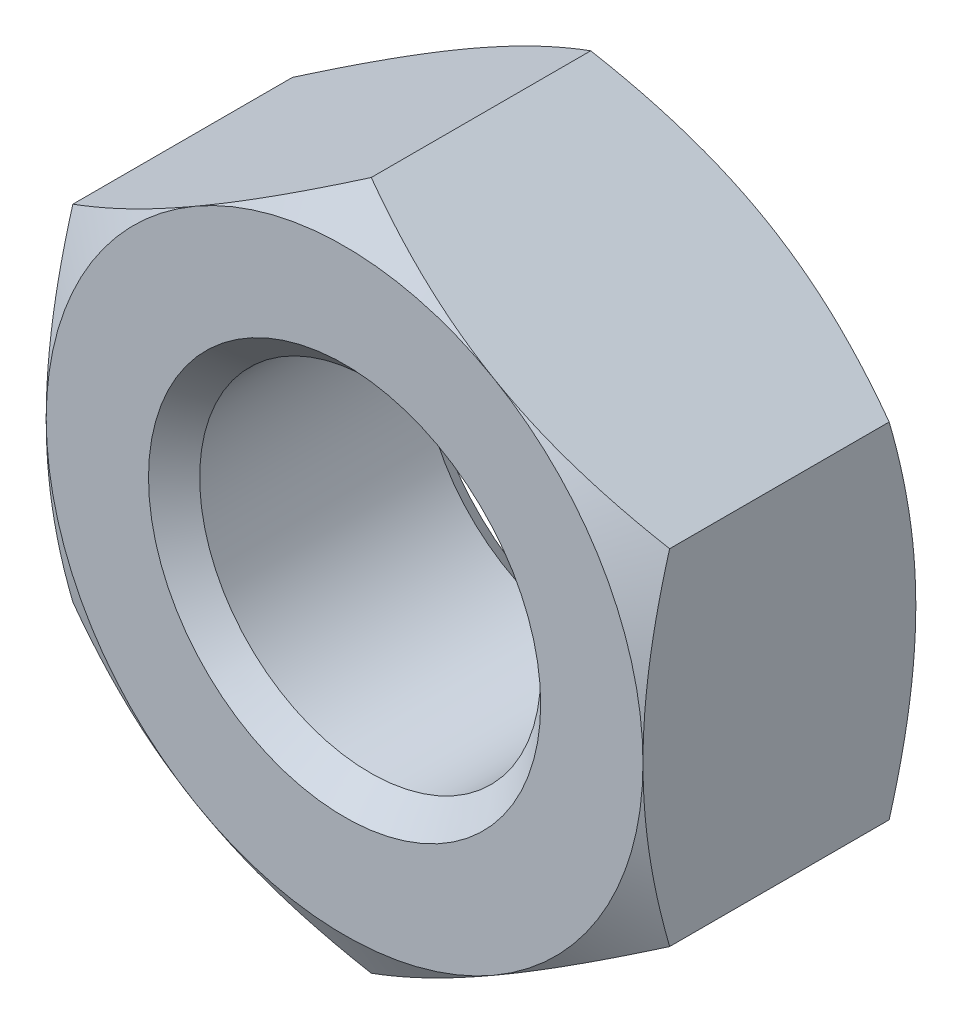
ISO-10303-21;
HEADER;
FILE_DESCRIPTION(('STEP AP214'),'2;1');
FILE_NAME('part.step','',(''),(''),'','','');
FILE_SCHEMA(('AUTOMOTIVE_DESIGN { 1 0 10303 214 1 1 1 1 }'));
ENDSEC;
DATA;
#1=APPLICATION_CONTEXT('core data for automotive mechanical design processes');
#2=APPLICATION_PROTOCOL_DEFINITION('international standard','automotive_design',2000,#1);
#3=PRODUCT_CONTEXT('',#1,'mechanical');
#4=PRODUCT('Part','Part','',(#3));
#5=PRODUCT_RELATED_PRODUCT_CATEGORY('part','',(#4));
#6=PRODUCT_DEFINITION_FORMATION('','',#4);
#7=PRODUCT_DEFINITION_CONTEXT('part definition',#1,'design');
#8=PRODUCT_DEFINITION('design','',#6,#7);
#9=PRODUCT_DEFINITION_SHAPE('','',#8);
#10=(LENGTH_UNIT() NAMED_UNIT(*) SI_UNIT(.MILLI.,.METRE.));
#11=(NAMED_UNIT(*) PLANE_ANGLE_UNIT() SI_UNIT($,.RADIAN.));
#12=(NAMED_UNIT(*) SI_UNIT($,.STERADIAN.) SOLID_ANGLE_UNIT());
#13=UNCERTAINTY_MEASURE_WITH_UNIT(LENGTH_MEASURE(1.E-05),#10,'distance_accuracy_value','');
#14=(GEOMETRIC_REPRESENTATION_CONTEXT(3) GLOBAL_UNCERTAINTY_ASSIGNED_CONTEXT((#13)) GLOBAL_UNIT_ASSIGNED_CONTEXT((#10,
#11,#12)) REPRESENTATION_CONTEXT('',''));
#15=CARTESIAN_POINT('',(0.,0.,0.));
#16=DIRECTION('',(0.,0.,1.));
#17=DIRECTION('',(1.,0.,0.));
#18=AXIS2_PLACEMENT_3D('',#15,#16,#17);
#19=CARTESIAN_POINT('',(0.,0.,3.2));
#20=DIRECTION('',(0.,0.,-1.));
#21=DIRECTION('',(-1.,0.,0.));
#22=AXIS2_PLACEMENT_3D('',#19,#20,#21);
#23=CONICAL_SURFACE('',#22,3.5,1.0471975511966);
#24=CARTESIAN_POINT('',(-0.000200000000001518,4.04156735438122,2.88732593930663));
#25=CARTESIAN_POINT('',(0.153607178452448,3.9527667384984,2.93861421101002));
#26=CARTESIAN_POINT('',(0.308742010834422,3.86319960126198,2.9852590461838));
#27=CARTESIAN_POINT('',(0.62169800657678,3.68251437287562,3.06667812446665));
#28=CARTESIAN_POINT('',(0.779524730787494,3.59139307116725,3.10142356441544));
#29=CARTESIAN_POINT('',(1.09322221038013,3.41027974688034,3.15550997281716));
#30=CARTESIAN_POINT('',(1.24904469916069,3.32031559103708,3.17521091373962));
#31=CARTESIAN_POINT('',(1.56142288720537,3.13996396008051,3.19872986726275));
#32=CARTESIAN_POINT('',(1.71797745103423,3.04957714051106,3.20256735545443));
#33=CARTESIAN_POINT('',(2.01050921992099,2.88068384499777,3.19458469812302));
#34=CARTESIAN_POINT('',(2.1465302124579,2.80215208834114,3.18472456593039));
#35=CARTESIAN_POINT('',(2.41768602028899,2.64560020969753,3.1534735331006));
#36=CARTESIAN_POINT('',(2.55281989768468,2.5675806292065,3.1320719567142));
#37=CARTESIAN_POINT('',(2.82453479240518,2.41070596159678,3.07856959211942));
#38=CARTESIAN_POINT('',(2.96108141927834,2.33187072981463,3.04624200555491));
#39=CARTESIAN_POINT('',(3.2321380929445,2.17537608630783,2.97287106619201));
#40=CARTESIAN_POINT('',(3.36665161246854,2.09771466960098,2.93184495343013));
#41=CARTESIAN_POINT('',(3.5002,2.02061047210985,2.88732593930663));
#42=B_SPLINE_CURVE_WITH_KNOTS('',3,(#24,#25,#26,#27,#28,#29,#30,#31,#32,#33,#34,#35,#36,#37,#38,
#39,#40,#41),.UNSPECIFIED.,.F.,.F.,(4,2,2,2,2,2,2,2,4),(0.,0.554793832886253,1.11092123814984,
1.65328467083219,2.19498204478403,2.6666513085086,3.13875761298267,3.6213361260051,
4.10296698719187),.UNSPECIFIED.);
#43=CARTESIAN_POINT('',(0.,4.04145188432738,2.88739260883036));
#44=VERTEX_POINT('',#43);
#45=CARTESIAN_POINT('',(1.75,3.03108891324554,3.2));
#46=VERTEX_POINT('',#45);
#47=EDGE_CURVE('E291',#44,#46,#42,.T.);
#48=ORIENTED_EDGE('',*,*,#47,.F.);
#49=CARTESIAN_POINT('',(-3.5002,2.02061047210985,2.88732593930663));
#50=CARTESIAN_POINT('',(-3.34639282154755,2.10941108799267,2.93861421101002));
#51=CARTESIAN_POINT('',(-3.19125798916558,2.19897822522909,2.9852590461838));
#52=CARTESIAN_POINT('',(-2.87830199342322,2.37966345361545,3.06667812446665));
#53=CARTESIAN_POINT('',(-2.72047526921251,2.47078475532382,3.10142356441544));
#54=CARTESIAN_POINT('',(-2.40677778961987,2.65189807961073,3.15550997281716));
#55=CARTESIAN_POINT('',(-2.25095530083931,2.74186223545399,3.17521091373962));
#56=CARTESIAN_POINT('',(-1.93857711279463,2.92221386641055,3.19872986726275));
#57=CARTESIAN_POINT('',(-1.78202254896577,3.01260068598001,3.20256735545443));
#58=CARTESIAN_POINT('',(-1.48949078007901,3.1814939814933,3.19458469812302));
#59=CARTESIAN_POINT('',(-1.3534697875421,3.26002573814993,3.18472456593039));
#60=CARTESIAN_POINT('',(-1.08231397971101,3.41657761679353,3.1534735331006));
#61=CARTESIAN_POINT('',(-0.947180102315319,3.49459719728457,3.1320719567142));
#62=CARTESIAN_POINT('',(-0.675465207594818,3.65147186489429,3.07856959211942));
#63=CARTESIAN_POINT('',(-0.538918580721666,3.73030709667644,3.04624200555491));
#64=CARTESIAN_POINT('',(-0.2678619070555,3.88680174018324,2.97287106619201));
#65=CARTESIAN_POINT('',(-0.133348387531465,3.96446315689009,2.93184495343013));
#66=CARTESIAN_POINT('',(0.000199999999998202,4.04156735438122,2.88732593930663));
#67=B_SPLINE_CURVE_WITH_KNOTS('',3,(#49,#50,#51,#52,#53,#54,#55,#56,#57,#58,#59,#60,#61,#62,#63,
#64,#65,#66),.UNSPECIFIED.,.F.,.F.,(4,2,2,2,2,2,2,2,4),(0.,0.554793832886254,1.11092123814984,
1.65328467083219,2.19498204478403,2.6666513085086,3.13875761298267,3.6213361260051,
4.10296698719187),.UNSPECIFIED.);
#68=CARTESIAN_POINT('',(-1.75,3.03108891324553,3.2));
#69=VERTEX_POINT('',#68);
#70=EDGE_CURVE('E186',#69,#44,#67,.T.);
#71=ORIENTED_EDGE('',*,*,#70,.F.);
#72=CARTESIAN_POINT('',(0.,0.,3.2));
#73=DIRECTION('',(0.,0.,1.));
#74=DIRECTION('',(1.,0.,0.));
#75=AXIS2_PLACEMENT_3D('',#72,#73,#74);
#76=CIRCLE('',#75,3.5);
#77=EDGE_CURVE('E294',#46,#69,#76,.T.);
#78=ORIENTED_EDGE('',*,*,#77,.F.);
#79=EDGE_LOOP('',(#48,#71,#78));
#80=FACE_BOUND('',#79,.T.);
#81=ADVANCED_FACE('F35',(#80),#23,.T.);
#82=CARTESIAN_POINT('',(3.5,2.02072594216369,2.88739260883036));
#83=VERTEX_POINT('',#82);
#84=EDGE_CURVE('E229',#46,#83,#42,.T.);
#85=ORIENTED_EDGE('',*,*,#84,.F.);
#86=CARTESIAN_POINT('',(3.5,0.,3.2));
#87=VERTEX_POINT('',#86);
#88=EDGE_CURVE('E151',#87,#46,#76,.T.);
#89=ORIENTED_EDGE('',*,*,#88,.F.);
#90=CARTESIAN_POINT('',(3.5,-5.39607057630177,1.50734573609674));
#91=CARTESIAN_POINT('',(3.5,-5.24346862247673,1.58124273616101));
#92=CARTESIAN_POINT('',(3.5,-5.09051292002839,1.65442190909415));
#93=CARTESIAN_POINT('',(3.5,-4.78370577730185,1.7989402305959));
#94=CARTESIAN_POINT('',(3.5,-4.62985419754606,1.87027908272174));
#95=CARTESIAN_POINT('',(3.5,-4.32025895347236,2.01107815289536));
#96=CARTESIAN_POINT('',(3.5,-4.16450952696473,2.08052574517121));
#97=CARTESIAN_POINT('',(3.5,-3.85176070717065,2.21653605641942));
#98=CARTESIAN_POINT('',(3.5,-3.69476137432274,2.28309891389066));
#99=CARTESIAN_POINT('',(3.5,-3.37431592405336,2.41460734938575));
#100=CARTESIAN_POINT('',(3.5,-3.2108219343119,2.47943692239225));
#101=CARTESIAN_POINT('',(3.5,-2.88190940227227,2.60411191634016));
#102=CARTESIAN_POINT('',(3.5,-2.71649064466644,2.66395677345412));
#103=CARTESIAN_POINT('',(3.5,-2.38378554444925,2.77706789162325));
#104=CARTESIAN_POINT('',(3.5,-2.21650387253554,2.8303477513776));
#105=CARTESIAN_POINT('',(3.5,-1.8795413289971,2.92859816989445));
#106=CARTESIAN_POINT('',(3.5,-1.70986124157588,2.97357137996499));
#107=CARTESIAN_POINT('',(3.5,-1.3689434124043,3.05279133870168));
#108=CARTESIAN_POINT('',(3.5,-1.19771918613086,3.08709516971169));
#109=CARTESIAN_POINT('',(3.5,-0.853175175643459,3.14301616552178));
#110=CARTESIAN_POINT('',(3.5,-0.679855580730875,3.16463446775436));
#111=CARTESIAN_POINT('',(3.5,-0.334236615485038,3.19317618303771));
#112=CARTESIAN_POINT('',(3.5,-0.161953022960658,3.20028595773065));
#113=CARTESIAN_POINT('',(3.5,0.182601685688735,3.19969645918549));
#114=CARTESIAN_POINT('',(3.5,0.354872801428766,3.19199684035087));
#115=CARTESIAN_POINT('',(3.5,0.648296301018979,3.16680984690181));
#116=CARTESIAN_POINT('',(3.5,0.769765843254159,3.1528140822278));
#117=CARTESIAN_POINT('',(3.5,1.01178934087345,3.11834848853307));
#118=CARTESIAN_POINT('',(3.5,1.13234316544353,3.09787775170697));
#119=CARTESIAN_POINT('',(3.5,1.49248573241487,3.02783185035844));
#120=CARTESIAN_POINT('',(3.5,1.73041517752013,2.96963661982691));
#121=CARTESIAN_POINT('',(3.5,2.08613420074905,2.86906323758495));
#122=CARTESIAN_POINT('',(3.5,2.20577628701295,2.83286695169684));
#123=CARTESIAN_POINT('',(3.5,2.44389767487858,2.75679942102856));
#124=CARTESIAN_POINT('',(3.5,2.56237696900387,2.71692815263634));
#125=CARTESIAN_POINT('',(3.5,2.79821193267016,2.63414347854069));
#126=CARTESIAN_POINT('',(3.5,2.91556797780058,2.59123113313497));
#127=CARTESIAN_POINT('',(3.5,3.14931345871437,2.50286044169987));
#128=CARTESIAN_POINT('',(3.5,3.26570290403954,2.45740212083747));
#129=CARTESIAN_POINT('',(3.5,3.53278888396184,2.35025761465171));
#130=CARTESIAN_POINT('',(3.5,3.68318747831663,2.2878301789543));
#131=CARTESIAN_POINT('',(3.5,3.98276288579305,2.16010312309237));
#132=CARTESIAN_POINT('',(3.5,4.13193963530471,2.09480335450574));
#133=CARTESIAN_POINT('',(3.5,4.57798586154448,1.89545429582979));
#134=CARTESIAN_POINT('',(3.5,4.873321089347,1.75797587256347));
#135=CARTESIAN_POINT('',(3.5,5.46135586713875,1.476869132841));
#136=CARTESIAN_POINT('',(3.5,5.75405271996685,1.33323523339219));
#137=CARTESIAN_POINT('',(3.5,6.33736064871425,1.04177841899646));
#138=CARTESIAN_POINT('',(3.5,6.62797165253629,0.893955360117037));
#139=CARTESIAN_POINT('',(3.5,7.18456120860241,0.607214161865801));
#140=CARTESIAN_POINT('',(3.5,7.45065793633446,0.468524639417716));
#141=CARTESIAN_POINT('',(3.5,7.98185207728762,0.189227104360424));
#142=CARTESIAN_POINT('',(3.5,8.24694945925495,0.0486190323749724));
#143=CARTESIAN_POINT('',(3.5,8.77575145405166,-0.233743054144649));
#144=CARTESIAN_POINT('',(3.5,9.03945786649943,-0.375493703344978));
#145=CARTESIAN_POINT('',(3.5,9.56622686486212,-0.660154863528819));
#146=CARTESIAN_POINT('',(3.5,9.82928948287438,-0.803065315089473));
#147=CARTESIAN_POINT('',(3.5,10.0921129259192,-0.9464112464489));
#148=B_SPLINE_CURVE_WITH_KNOTS('',3,(#90,#91,#92,#93,#94,#95,#96,#97,#98,#99,#100,#101,#102,
#103,#104,#105,#106,#107,#108,#109,#110,#111,#112,#113,#114,#115,#116,#117,#118,#119,#120,#121,
#122,#123,#124,#125,#126,#127,#128,#129,#130,#131,#132,#133,#134,#135,#136,#137,#138,#139,#140,
#141,#142,#143,#144,#145,#146,#147),.UNSPECIFIED.,.F.,.F.,(4,2,2,2,2,2,2,2,2,2,2,2,2,2,2,2,2,2,
2,2,2,2,2,2,2,2,2,2,4),(0.,0.508664516050691,1.01741046359623,1.52898032030911,2.04052558879345,
2.56809753708544,3.09572907889285,3.62224862786082,4.14859983134042,4.67208453173465,
5.19552228733582,5.71219306738588,6.22887590476894,6.59551693856609,6.96220939904642,
7.69601555923292,8.07097772947722,8.44594230905185,8.8207767911628,9.19560756868767,
9.68408848540199,10.1725946731184,11.1497698508896,12.1278509000315,13.1059655952369,
14.0061676995822,14.9063977273167,15.8045643362225,16.7026852141871),.UNSPECIFIED.);
#149=EDGE_CURVE('E227',#83,#87,#148,.F.);
#150=ORIENTED_EDGE('',*,*,#149,.F.);
#151=EDGE_LOOP('',(#85,#89,#150));
#152=FACE_BOUND('',#151,.T.);
#153=ADVANCED_FACE('F282',(#152),#23,.T.);
#154=CARTESIAN_POINT('',(3.5,-2.02072594216369,2.88739260883036));
#155=VERTEX_POINT('',#154);
#156=EDGE_CURVE('E222',#87,#155,#148,.F.);
#157=ORIENTED_EDGE('',*,*,#156,.F.);
#158=CARTESIAN_POINT('',(1.75,-3.03108891324554,3.2));
#159=VERTEX_POINT('',#158);
#160=EDGE_CURVE('E297',#159,#87,#76,.T.);
#161=ORIENTED_EDGE('',*,*,#160,.F.);
#162=CARTESIAN_POINT('',(3.5002,-2.02061047210985,2.88732593930663));
#163=CARTESIAN_POINT('',(3.34639282154755,-2.10941108799267,2.93861421101002));
#164=CARTESIAN_POINT('',(3.19125798916558,-2.19897822522909,2.9852590461838));
#165=CARTESIAN_POINT('',(2.87830199342322,-2.37966345361545,3.06667812446665));
#166=CARTESIAN_POINT('',(2.72047526921251,-2.47078475532382,3.10142356441544));
#167=CARTESIAN_POINT('',(2.40677778961987,-2.65189807961073,3.15550997281716));
#168=CARTESIAN_POINT('',(2.25095530083931,-2.74186223545399,3.17521091373962));
#169=CARTESIAN_POINT('',(1.93857711279463,-2.92221386641056,3.19872986726274));
#170=CARTESIAN_POINT('',(1.78202254896577,-3.01260068598001,3.20256735545443));
#171=CARTESIAN_POINT('',(1.48949078007901,-3.1814939814933,3.19458469812302));
#172=CARTESIAN_POINT('',(1.35346978754209,-3.26002573814993,3.18472456593039));
#173=CARTESIAN_POINT('',(1.08231397971101,-3.41657761679354,3.1534735331006));
#174=CARTESIAN_POINT('',(0.947180102315318,-3.49459719728458,3.1320719567142));
#175=CARTESIAN_POINT('',(0.675465207594817,-3.65147186489429,3.07856959211942));
#176=CARTESIAN_POINT('',(0.538918580721666,-3.73030709667644,3.04624200555491));
#177=CARTESIAN_POINT('',(0.2678619070555,-3.88680174018324,2.97287106619201));
#178=CARTESIAN_POINT('',(0.133348387531465,-3.96446315689009,2.93184495343013));
#179=CARTESIAN_POINT('',(-0.000199999999998495,-4.04156735438122,2.88732593930663));
#180=B_SPLINE_CURVE_WITH_KNOTS('',3,(#162,#163,#164,#165,#166,#167,#168,#169,#170,#171,#172,
#173,#174,#175,#176,#177,#178,#179),.UNSPECIFIED.,.F.,.F.,(4,2,2,2,2,2,2,2,4),(0.,
0.554793832886254,1.11092123814984,1.65328467083219,2.19498204478403,2.6666513085086,
3.13875761298267,3.6213361260051,4.10296698719187),.UNSPECIFIED.);
#181=EDGE_CURVE('E228',#155,#159,#180,.T.);
#182=ORIENTED_EDGE('',*,*,#181,.F.);
#183=EDGE_LOOP('',(#157,#161,#182));
#184=FACE_BOUND('',#183,.T.);
#185=ADVANCED_FACE('F287',(#184),#23,.T.);
#186=CARTESIAN_POINT('',(0.,-4.04145188432738,2.88739260883036));
#187=VERTEX_POINT('',#186);
#188=EDGE_CURVE('E216',#159,#187,#180,.T.);
#189=ORIENTED_EDGE('',*,*,#188,.F.);
#190=CARTESIAN_POINT('',(-1.75,-3.03108891324554,3.2));
#191=VERTEX_POINT('',#190);
#192=EDGE_CURVE('E299',#191,#159,#76,.T.);
#193=ORIENTED_EDGE('',*,*,#192,.F.);
#194=CARTESIAN_POINT('',(0.000200000000000867,-4.04156735438122,2.88732593930663));
#195=CARTESIAN_POINT('',(-0.153607178452449,-3.9527667384984,2.93861421101002));
#196=CARTESIAN_POINT('',(-0.308742010834423,-3.86319960126198,2.9852590461838));
#197=CARTESIAN_POINT('',(-0.621698006576781,-3.68251437287562,3.06667812446665));
#198=CARTESIAN_POINT('',(-0.779524730787495,-3.59139307116725,3.10142356441544));
#199=CARTESIAN_POINT('',(-1.09322221038013,-3.41027974688034,3.15550997281716));
#200=CARTESIAN_POINT('',(-1.24904469916069,-3.32031559103708,3.17521091373962));
#201=CARTESIAN_POINT('',(-1.56142288720537,-3.13996396008052,3.19872986726274));
#202=CARTESIAN_POINT('',(-1.71797745103423,-3.04957714051106,3.20256735545443));
#203=CARTESIAN_POINT('',(-2.01050921992099,-2.88068384499777,3.19458469812302));
#204=CARTESIAN_POINT('',(-2.14653021245791,-2.80215208834114,3.18472456593039));
#205=CARTESIAN_POINT('',(-2.41768602028899,-2.64560020969753,3.1534735331006));
#206=CARTESIAN_POINT('',(-2.55281989768468,-2.5675806292065,3.1320719567142));
#207=CARTESIAN_POINT('',(-2.82453479240518,-2.41070596159678,3.07856959211942));
#208=CARTESIAN_POINT('',(-2.96108141927834,-2.33187072981464,3.04624200555491));
#209=CARTESIAN_POINT('',(-3.2321380929445,-2.17537608630783,2.97287106619201));
#210=CARTESIAN_POINT('',(-3.36665161246854,-2.09771466960098,2.93184495343013));
#211=CARTESIAN_POINT('',(-3.5002,-2.02061047210985,2.88732593930663));
#212=B_SPLINE_CURVE_WITH_KNOTS('',3,(#194,#195,#196,#197,#198,#199,#200,#201,#202,#203,#204,
#205,#206,#207,#208,#209,#210,#211),.UNSPECIFIED.,.F.,.F.,(4,2,2,2,2,2,2,2,4),(0.,
0.554793832886254,1.11092123814984,1.65328467083219,2.19498204478403,2.6666513085086,
3.13875761298267,3.6213361260051,4.10296698719187),.UNSPECIFIED.);
#213=EDGE_CURVE('E323',#187,#191,#212,.T.);
#214=ORIENTED_EDGE('',*,*,#213,.F.);
#215=EDGE_LOOP('',(#189,#193,#214));
#216=FACE_BOUND('',#215,.T.);
#217=ADVANCED_FACE('F327',(#216),#23,.T.);
#218=CARTESIAN_POINT('',(-3.5,-2.02072594216369,2.88739260883036));
#219=VERTEX_POINT('',#218);
#220=EDGE_CURVE('E211',#191,#219,#212,.T.);
#221=ORIENTED_EDGE('',*,*,#220,.F.);
#222=CARTESIAN_POINT('',(-3.5,0.,3.2));
#223=VERTEX_POINT('',#222);
#224=EDGE_CURVE('E314',#223,#191,#76,.T.);
#225=ORIENTED_EDGE('',*,*,#224,.F.);
#226=CARTESIAN_POINT('',(-3.5,-5.39607057630177,1.50734573609674));
#227=CARTESIAN_POINT('',(-3.5,-5.24346862247673,1.58124273616101));
#228=CARTESIAN_POINT('',(-3.5,-5.0905129200284,1.65442190909415));
#229=CARTESIAN_POINT('',(-3.5,-4.78370577730185,1.7989402305959));
#230=CARTESIAN_POINT('',(-3.5,-4.62985419754606,1.87027908272174));
#231=CARTESIAN_POINT('',(-3.5,-4.32025895347236,2.01107815289536));
#232=CARTESIAN_POINT('',(-3.5,-4.16450952696474,2.08052574517121));
#233=CARTESIAN_POINT('',(-3.5,-3.85176070717066,2.21653605641942));
#234=CARTESIAN_POINT('',(-3.5,-3.69476137432274,2.28309891389066));
#235=CARTESIAN_POINT('',(-3.5,-3.37431592405336,2.41460734938575));
#236=CARTESIAN_POINT('',(-3.5,-3.2108219343119,2.47943692239225));
#237=CARTESIAN_POINT('',(-3.5,-2.88190940227227,2.60411191634016));
#238=CARTESIAN_POINT('',(-3.5,-2.71649064466644,2.66395677345412));
#239=CARTESIAN_POINT('',(-3.5,-2.38378554444925,2.77706789162325));
#240=CARTESIAN_POINT('',(-3.5,-2.21650387253554,2.8303477513776));
#241=CARTESIAN_POINT('',(-3.5,-1.8795413289971,2.92859816989445));
#242=CARTESIAN_POINT('',(-3.5,-1.70986124157588,2.97357137996499));
#243=CARTESIAN_POINT('',(-3.5,-1.36894341240431,3.05279133870168));
#244=CARTESIAN_POINT('',(-3.5,-1.19771918613086,3.08709516971169));
#245=CARTESIAN_POINT('',(-3.5,-0.853175175643461,3.14301616552178));
#246=CARTESIAN_POINT('',(-3.5,-0.679855580730877,3.16463446775436));
#247=CARTESIAN_POINT('',(-3.5,-0.33423661548504,3.19317618303771));
#248=CARTESIAN_POINT('',(-3.5,-0.16195302296066,3.20028595773065));
#249=CARTESIAN_POINT('',(-3.5,0.182601685688732,3.19969645918549));
#250=CARTESIAN_POINT('',(-3.5,0.354872801428764,3.19199684035087));
#251=CARTESIAN_POINT('',(-3.5,0.648296301018978,3.16680984690181));
#252=CARTESIAN_POINT('',(-3.5,0.769765843254157,3.1528140822278));
#253=CARTESIAN_POINT('',(-3.5,1.01178934087345,3.11834848853307));
#254=CARTESIAN_POINT('',(-3.5,1.13234316544352,3.09787775170697));
#255=CARTESIAN_POINT('',(-3.5,1.49248573241487,3.02783185035844));
#256=CARTESIAN_POINT('',(-3.5,1.73041517752012,2.96963661982691));
#257=CARTESIAN_POINT('',(-3.5,2.08613420074904,2.86906323758495));
#258=CARTESIAN_POINT('',(-3.5,2.20577628701295,2.83286695169684));
#259=CARTESIAN_POINT('',(-3.5,2.44389767487858,2.75679942102856));
#260=CARTESIAN_POINT('',(-3.5,2.56237696900387,2.71692815263633));
#261=CARTESIAN_POINT('',(-3.5,2.79821193267016,2.63414347854069));
#262=CARTESIAN_POINT('',(-3.5,2.91556797780058,2.59123113313497));
#263=CARTESIAN_POINT('',(-3.5,3.14931345871437,2.50286044169987));
#264=CARTESIAN_POINT('',(-3.5,3.26570290403954,2.45740212083747));
#265=CARTESIAN_POINT('',(-3.5,3.53278888396184,2.3502576146517));
#266=CARTESIAN_POINT('',(-3.5,3.68318747831663,2.2878301789543));
#267=CARTESIAN_POINT('',(-3.5,3.98276288579305,2.16010312309237));
#268=CARTESIAN_POINT('',(-3.5,4.13193963530471,2.09480335450574));
#269=CARTESIAN_POINT('',(-3.5,4.57798586154448,1.89545429582979));
#270=CARTESIAN_POINT('',(-3.5,4.87332108934701,1.75797587256347));
#271=CARTESIAN_POINT('',(-3.5,5.46135586713875,1.476869132841));
#272=CARTESIAN_POINT('',(-3.5,5.75405271996685,1.33323523339219));
#273=CARTESIAN_POINT('',(-3.5,6.33736064871425,1.04177841899645));
#274=CARTESIAN_POINT('',(-3.5,6.6279716525363,0.893955360117035));
#275=CARTESIAN_POINT('',(-3.5,7.18456120860241,0.607214161865799));
#276=CARTESIAN_POINT('',(-3.5,7.45065793633446,0.468524639417714));
#277=CARTESIAN_POINT('',(-3.5,7.98185207728762,0.189227104360423));
#278=CARTESIAN_POINT('',(-3.5,8.24694945925495,0.0486190323749717));
#279=CARTESIAN_POINT('',(-3.5,8.77575145405166,-0.23374305414465));
#280=CARTESIAN_POINT('',(-3.5,9.03945786649943,-0.37549370334498));
#281=CARTESIAN_POINT('',(-3.5,9.56622686486212,-0.660154863528822));
#282=CARTESIAN_POINT('',(-3.5,9.82928948287438,-0.803065315089476));
#283=CARTESIAN_POINT('',(-3.5,10.0921129259192,-0.946411246448901));
#284=B_SPLINE_CURVE_WITH_KNOTS('',3,(#226,#227,#228,#229,#230,#231,#232,#233,#234,#235,#236,
#237,#238,#239,#240,#241,#242,#243,#244,#245,#246,#247,#248,#249,#250,#251,#252,#253,#254,#255,
#256,#257,#258,#259,#260,#261,#262,#263,#264,#265,#266,#267,#268,#269,#270,#271,#272,#273,#274,
#275,#276,#277,#278,#279,#280,#281,#282,#283),.UNSPECIFIED.,.F.,.F.,(4,2,2,2,2,2,2,2,2,2,2,2,2,
2,2,2,2,2,2,2,2,2,2,2,2,2,2,2,4),(0.,0.508664516050691,1.01741046359623,1.52898032030911,
2.04052558879344,2.56809753708544,3.09572907889285,3.62224862786082,4.14859983134042,
4.67208453173465,5.19552228733582,5.71219306738588,6.22887590476894,6.59551693856609,
6.96220939904642,7.69601555923292,8.07097772947722,8.44594230905185,8.82077679116281,
9.19560756868767,9.68408848540199,10.1725946731185,11.1497698508896,12.1278509000315,
13.1059655952369,14.0061676995822,14.9063977273167,15.8045643362226,16.7026852141871),.UNSPECIFIED.);
#285=EDGE_CURVE('E319',#219,#223,#284,.T.);
#286=ORIENTED_EDGE('',*,*,#285,.F.);
#287=EDGE_LOOP('',(#221,#225,#286));
#288=FACE_BOUND('',#287,.T.);
#289=ADVANCED_FACE('F203',(#288),#23,.T.);
#290=CARTESIAN_POINT('',(0.,0.,0.577350269189625));
#291=DIRECTION('',(0.,0.,1.));
#292=DIRECTION('',(1.,0.,0.));
#293=AXIS2_PLACEMENT_3D('',#290,#291,#292);
#294=CONICAL_SURFACE('',#293,4.5,1.0471975511966);
#295=CARTESIAN_POINT('',(-0.000199999999999035,-4.04156735438122,0.312674060693372));
#296=CARTESIAN_POINT('',(0.153607178452451,-3.9527667384984,0.261385788989985));
#297=CARTESIAN_POINT('',(0.308742010834425,-3.86319960126198,0.214740953816199));
#298=CARTESIAN_POINT('',(0.621698006576783,-3.68251437287562,0.133321875533351));
#299=CARTESIAN_POINT('',(0.779524730787497,-3.59139307116725,0.0985764355845635));
#300=CARTESIAN_POINT('',(1.09322221038013,-3.41027974688034,0.0444900271828383));
#301=CARTESIAN_POINT('',(1.24904469916069,-3.32031559103708,0.0247890862603838));
#302=CARTESIAN_POINT('',(1.56142288720538,-3.13996396008052,0.00127013273725661));
#303=CARTESIAN_POINT('',(1.71797745103423,-3.04957714051106,-0.00256735545443255));
#304=CARTESIAN_POINT('',(2.01050921992099,-2.88068384499777,0.00541530187698005));
#305=CARTESIAN_POINT('',(2.14653021245791,-2.80215208834114,0.0152754340696096));
#306=CARTESIAN_POINT('',(2.417686020289,-2.64560020969753,0.046526466899406));
#307=CARTESIAN_POINT('',(2.55281989768468,-2.5675806292065,0.0679280432858004));
#308=CARTESIAN_POINT('',(2.82453479240518,-2.41070596159678,0.121430407880579));
#309=CARTESIAN_POINT('',(2.96108141927834,-2.33187072981463,0.153757994445089));
#310=CARTESIAN_POINT('',(3.2321380929445,-2.17537608630783,0.227128933807996));
#311=CARTESIAN_POINT('',(3.36665161246854,-2.09771466960098,0.268155046569868));
#312=CARTESIAN_POINT('',(3.5002,-2.02061047210985,0.312674060693373));
#313=B_SPLINE_CURVE_WITH_KNOTS('',3,(#295,#296,#297,#298,#299,#300,#301,#302,#303,#304,#305,
#306,#307,#308,#309,#310,#311,#312),.UNSPECIFIED.,.F.,.F.,(4,2,2,2,2,2,2,2,4),(0.,
0.554793832886254,1.11092123814984,1.65328467083219,2.19498204478403,2.6666513085086,
3.13875761298267,3.6213361260051,4.10296698719187),.UNSPECIFIED.);
#314=CARTESIAN_POINT('',(0.,-4.04145188432738,0.312607391169644));
#315=VERTEX_POINT('',#314);
#316=CARTESIAN_POINT('',(1.75,-3.03108891324554,0.));
#317=VERTEX_POINT('',#316);
#318=EDGE_CURVE('E259',#315,#317,#313,.T.);
#319=ORIENTED_EDGE('',*,*,#318,.F.);
#320=CARTESIAN_POINT('',(-3.5002,-2.02061047210985,0.312674060693372));
#321=CARTESIAN_POINT('',(-3.34639282154755,-2.10941108799267,0.261385788989984));
#322=CARTESIAN_POINT('',(-3.19125798916558,-2.19897822522909,0.214740953816198));
#323=CARTESIAN_POINT('',(-2.87830199342322,-2.37966345361545,0.13332187553335));
#324=CARTESIAN_POINT('',(-2.7204752692125,-2.47078475532382,0.0985764355845631));
#325=CARTESIAN_POINT('',(-2.40677778961987,-2.65189807961074,0.0444900271828379));
#326=CARTESIAN_POINT('',(-2.25095530083931,-2.74186223545399,0.0247890862603833));
#327=CARTESIAN_POINT('',(-1.93857711279463,-2.92221386641056,0.00127013273725632));
#328=CARTESIAN_POINT('',(-1.78202254896577,-3.01260068598001,-0.00256735545443262));
#329=CARTESIAN_POINT('',(-1.48949078007901,-3.1814939814933,0.00541530187697988));
#330=CARTESIAN_POINT('',(-1.35346978754209,-3.26002573814993,0.0152754340696092));
#331=CARTESIAN_POINT('',(-1.08231397971101,-3.41657761679354,0.0465264668994054));
#332=CARTESIAN_POINT('',(-0.947180102315317,-3.49459719728458,0.0679280432857999));
#333=CARTESIAN_POINT('',(-0.675465207594816,-3.65147186489429,0.121430407880578));
#334=CARTESIAN_POINT('',(-0.538918580721664,-3.73030709667644,0.153757994445088));
#335=CARTESIAN_POINT('',(-0.267861907055498,-3.88680174018324,0.227128933807995));
#336=CARTESIAN_POINT('',(-0.133348387531463,-3.96446315689009,0.268155046569868));
#337=CARTESIAN_POINT('',(0.000200000000000518,-4.04156735438122,0.312674060693372));
#338=B_SPLINE_CURVE_WITH_KNOTS('',3,(#320,#321,#322,#323,#324,#325,#326,#327,#328,#329,#330,
#331,#332,#333,#334,#335,#336,#337),.UNSPECIFIED.,.F.,.F.,(4,2,2,2,2,2,2,2,4),(0.,
0.554793832886254,1.11092123814984,1.65328467083219,2.19498204478403,2.6666513085086,
3.13875761298267,3.6213361260051,4.10296698719187),.UNSPECIFIED.);
#339=CARTESIAN_POINT('',(-1.75,-3.03108891324554,0.));
#340=VERTEX_POINT('',#339);
#341=EDGE_CURVE('E260',#340,#315,#338,.T.);
#342=ORIENTED_EDGE('',*,*,#341,.F.);
#343=CARTESIAN_POINT('',(0.,0.,0.));
#344=DIRECTION('',(0.,0.,1.));
#345=DIRECTION('',(1.,0.,0.));
#346=AXIS2_PLACEMENT_3D('',#343,#344,#345);
#347=CIRCLE('',#346,3.5);
#348=EDGE_CURVE('E162',#317,#340,#347,.F.);
#349=ORIENTED_EDGE('',*,*,#348,.F.);
#350=EDGE_LOOP('',(#319,#342,#349));
#351=FACE_BOUND('',#350,.T.);
#352=ADVANCED_FACE('F358',(#351),#294,.T.);
#353=CARTESIAN_POINT('',(3.5,-2.02072594216369,0.312607391169644));
#354=VERTEX_POINT('',#353);
#355=EDGE_CURVE('E254',#317,#354,#313,.T.);
#356=ORIENTED_EDGE('',*,*,#355,.F.);
#357=CARTESIAN_POINT('',(3.5,0.,0.));
#358=VERTEX_POINT('',#357);
#359=EDGE_CURVE('E153',#358,#317,#347,.F.);
#360=ORIENTED_EDGE('',*,*,#359,.F.);
#361=CARTESIAN_POINT('',(3.5,-5.39607057630177,1.69265426390326));
#362=CARTESIAN_POINT('',(3.5,-5.24346862247673,1.61875726383899));
#363=CARTESIAN_POINT('',(3.5,-5.0905129200284,1.54557809090586));
#364=CARTESIAN_POINT('',(3.5,-4.78370577730185,1.40105976940411));
#365=CARTESIAN_POINT('',(3.5,-4.62985419754606,1.32972091727826));
#366=CARTESIAN_POINT('',(3.5,-4.32025895347236,1.18892184710464));
#367=CARTESIAN_POINT('',(3.5,-4.16450952696473,1.11947425482879));
#368=CARTESIAN_POINT('',(3.5,-3.85176070717065,0.983463943580582));
#369=CARTESIAN_POINT('',(3.5,-3.69476137432274,0.91690108610934));
#370=CARTESIAN_POINT('',(3.5,-3.37431592405336,0.785392650614253));
#371=CARTESIAN_POINT('',(3.5,-3.2108219343119,0.720563077607755));
#372=CARTESIAN_POINT('',(3.5,-2.88190940227227,0.595888083659845));
#373=CARTESIAN_POINT('',(3.5,-2.71649064466644,0.536043226545886));
#374=CARTESIAN_POINT('',(3.5,-2.38378554444925,0.422932108376754));
#375=CARTESIAN_POINT('',(3.5,-2.21650387253554,0.3696522486224));
#376=CARTESIAN_POINT('',(3.5,-1.8795413289971,0.271401830105552));
#377=CARTESIAN_POINT('',(3.5,-1.70986124157588,0.226428620035015));
#378=CARTESIAN_POINT('',(3.5,-1.3689434124043,0.147208661298317));
#379=CARTESIAN_POINT('',(3.5,-1.19771918613086,0.112904830288311));
#380=CARTESIAN_POINT('',(3.5,-0.853175175643458,0.0569838344782178));
#381=CARTESIAN_POINT('',(3.5,-0.679855580730874,0.0353655322456451));
#382=CARTESIAN_POINT('',(3.5,-0.334236615485037,0.00682381696228985));
#383=CARTESIAN_POINT('',(3.5,-0.161953022960657,-0.000285957730646323));
#384=CARTESIAN_POINT('',(3.5,0.182601685688735,0.000303540814513361));
#385=CARTESIAN_POINT('',(3.5,0.354872801428766,0.00800315964912785));
#386=CARTESIAN_POINT('',(3.5,0.64829630101898,0.0331901530981943));
#387=CARTESIAN_POINT('',(3.5,0.76976584325416,0.047185917772199));
#388=CARTESIAN_POINT('',(3.5,1.01178934087345,0.0816515114669294));
#389=CARTESIAN_POINT('',(3.5,1.13234316544353,0.102122248293027));
#390=CARTESIAN_POINT('',(3.5,1.49248573241487,0.172168149641566));
#391=CARTESIAN_POINT('',(3.5,1.73041517752013,0.230363380173091));
#392=CARTESIAN_POINT('',(3.5,2.08613420074905,0.330936762415049));
#393=CARTESIAN_POINT('',(3.5,2.20577628701295,0.367133048303164));
#394=CARTESIAN_POINT('',(3.5,2.44389767487859,0.443200578971441));
#395=CARTESIAN_POINT('',(3.5,2.56237696900388,0.483071847363665));
#396=CARTESIAN_POINT('',(3.5,2.79821193267016,0.565856521459307));
#397=CARTESIAN_POINT('',(3.5,2.91556797780058,0.608768866865032));
#398=CARTESIAN_POINT('',(3.5,3.14931345871437,0.697139558300129));
#399=CARTESIAN_POINT('',(3.5,3.26570290403954,0.742597879162528));
#400=CARTESIAN_POINT('',(3.5,3.53278888396184,0.849742385348295));
#401=CARTESIAN_POINT('',(3.5,3.68318747831663,0.912169821045696));
#402=CARTESIAN_POINT('',(3.5,3.98276288579305,1.03989687690763));
#403=CARTESIAN_POINT('',(3.5,4.13193963530471,1.10519664549426));
#404=CARTESIAN_POINT('',(3.5,4.57798586154448,1.30454570417021));
#405=CARTESIAN_POINT('',(3.5,4.87332108934701,1.44202412743653));
#406=CARTESIAN_POINT('',(3.5,5.46135586713875,1.723130867159));
#407=CARTESIAN_POINT('',(3.5,5.75405271996685,1.86676476660781));
#408=CARTESIAN_POINT('',(3.5,6.33736064871425,2.15822158100355));
#409=CARTESIAN_POINT('',(3.5,6.6279716525363,2.30604463988296));
#410=CARTESIAN_POINT('',(3.5,7.18456120860242,2.5927858381342));
#411=CARTESIAN_POINT('',(3.5,7.45065793633446,2.73147536058228));
#412=CARTESIAN_POINT('',(3.5,7.98185207728762,3.01077289563958));
#413=CARTESIAN_POINT('',(3.5,8.24694945925495,3.15138096762503));
#414=CARTESIAN_POINT('',(3.5,8.77575145405166,3.43374305414465));
#415=CARTESIAN_POINT('',(3.5,9.03945786649944,3.57549370334498));
#416=CARTESIAN_POINT('',(3.5,9.56622686486212,3.86015486352882));
#417=CARTESIAN_POINT('',(3.5,9.82928948287438,4.00306531508947));
#418=CARTESIAN_POINT('',(3.5,10.0921129259192,4.1464112464489));
#419=B_SPLINE_CURVE_WITH_KNOTS('',3,(#361,#362,#363,#364,#365,#366,#367,#368,#369,#370,#371,
#372,#373,#374,#375,#376,#377,#378,#379,#380,#381,#382,#383,#384,#385,#386,#387,#388,#389,#390,
#391,#392,#393,#394,#395,#396,#397,#398,#399,#400,#401,#402,#403,#404,#405,#406,#407,#408,#409,
#410,#411,#412,#413,#414,#415,#416,#417,#418),.UNSPECIFIED.,.F.,.F.,(4,2,2,2,2,2,2,2,2,2,2,2,2,
2,2,2,2,2,2,2,2,2,2,2,2,2,2,2,4),(0.,0.508664516050691,1.01741046359623,1.52898032030911,
2.04052558879345,2.56809753708544,3.09572907889285,3.62224862786082,4.14859983134042,
4.67208453173465,5.19552228733582,5.71219306738588,6.22887590476894,6.5955169385661,
6.96220939904642,7.69601555923292,8.07097772947723,8.44594230905185,8.82077679116281,
9.19560756868767,9.68408848540199,10.1725946731185,11.1497698508896,12.1278509000315,
13.105965595237,14.0061676995822,14.9063977273167,15.8045643362226,16.7026852141871),.UNSPECIFIED.);
#420=EDGE_CURVE('E249',#354,#358,#419,.T.);
#421=ORIENTED_EDGE('',*,*,#420,.F.);
#422=EDGE_LOOP('',(#356,#360,#421));
#423=FACE_BOUND('',#422,.T.);
#424=ADVANCED_FACE('F353',(#423),#294,.T.);
#425=CARTESIAN_POINT('',(3.5,2.02072594216369,0.312607391169644));
#426=VERTEX_POINT('',#425);
#427=EDGE_CURVE('E147',#358,#426,#419,.T.);
#428=ORIENTED_EDGE('',*,*,#427,.F.);
#429=CARTESIAN_POINT('',(1.75,3.03108891324554,0.));
#430=VERTEX_POINT('',#429);
#431=EDGE_CURVE('E145',#430,#358,#347,.F.);
#432=ORIENTED_EDGE('',*,*,#431,.F.);
#433=CARTESIAN_POINT('',(3.5002,2.02061047210985,0.312674060693372));
#434=CARTESIAN_POINT('',(3.34639282154755,2.10941108799267,0.261385788989984));
#435=CARTESIAN_POINT('',(3.19125798916558,2.19897822522909,0.214740953816198));
#436=CARTESIAN_POINT('',(2.87830199342322,2.37966345361545,0.13332187553335));
#437=CARTESIAN_POINT('',(2.7204752692125,2.47078475532382,0.0985764355845626));
#438=CARTESIAN_POINT('',(2.40677778961987,2.65189807961073,0.0444900271828376));
#439=CARTESIAN_POINT('',(2.25095530083931,2.74186223545399,0.0247890862603831));
#440=CARTESIAN_POINT('',(1.93857711279463,2.92221386641055,0.0012701327372558));
#441=CARTESIAN_POINT('',(1.78202254896577,3.01260068598001,-0.00256735545443357));
#442=CARTESIAN_POINT('',(1.48949078007901,3.1814939814933,0.00541530187697881));
#443=CARTESIAN_POINT('',(1.35346978754209,3.26002573814993,0.0152754340696084));
#444=CARTESIAN_POINT('',(1.08231397971101,3.41657761679354,0.0465264668994047));
#445=CARTESIAN_POINT('',(0.947180102315317,3.49459719728457,0.0679280432857991));
#446=CARTESIAN_POINT('',(0.675465207594816,3.65147186489429,0.121430407880578));
#447=CARTESIAN_POINT('',(0.538918580721664,3.73030709667644,0.153757994445087));
#448=CARTESIAN_POINT('',(0.267861907055497,3.88680174018324,0.227128933807995));
#449=CARTESIAN_POINT('',(0.133348387531462,3.96446315689009,0.268155046569867));
#450=CARTESIAN_POINT('',(-0.000200000000001076,4.04156735438122,0.312674060693371));
#451=B_SPLINE_CURVE_WITH_KNOTS('',3,(#433,#434,#435,#436,#437,#438,#439,#440,#441,#442,#443,
#444,#445,#446,#447,#448,#449,#450),.UNSPECIFIED.,.F.,.F.,(4,2,2,2,2,2,2,2,4),(0.,
0.554793832886254,1.11092123814984,1.65328467083219,2.19498204478403,2.6666513085086,
3.13875761298267,3.6213361260051,4.10296698719187),.UNSPECIFIED.);
#452=EDGE_CURVE('E125',#426,#430,#451,.T.);
#453=ORIENTED_EDGE('',*,*,#452,.F.);
#454=EDGE_LOOP('',(#428,#432,#453));
#455=FACE_BOUND('',#454,.T.);
#456=ADVANCED_FACE('F146',(#455),#294,.T.);
#457=CARTESIAN_POINT('',(-3.5,-2.02072594216369,0.312607391169644));
#458=VERTEX_POINT('',#457);
#459=EDGE_CURVE('E250',#458,#340,#338,.T.);
#460=ORIENTED_EDGE('',*,*,#459,.F.);
#461=CARTESIAN_POINT('',(-3.5,-5.39607057630177,1.69265426390326));
#462=CARTESIAN_POINT('',(-3.5,-5.24346862247673,1.61875726383899));
#463=CARTESIAN_POINT('',(-3.5,-5.0905129200284,1.54557809090585));
#464=CARTESIAN_POINT('',(-3.5,-4.78370577730185,1.4010597694041));
#465=CARTESIAN_POINT('',(-3.5,-4.62985419754606,1.32972091727826));
#466=CARTESIAN_POINT('',(-3.5,-4.32025895347236,1.18892184710464));
#467=CARTESIAN_POINT('',(-3.5,-4.16450952696474,1.11947425482879));
#468=CARTESIAN_POINT('',(-3.5,-3.85176070717066,0.983463943580581));
#469=CARTESIAN_POINT('',(-3.5,-3.69476137432274,0.91690108610934));
#470=CARTESIAN_POINT('',(-3.5,-3.37431592405336,0.785392650614253));
#471=CARTESIAN_POINT('',(-3.5,-3.2108219343119,0.720563077607755));
#472=CARTESIAN_POINT('',(-3.5,-2.88190940227227,0.595888083659844));
#473=CARTESIAN_POINT('',(-3.5,-2.71649064466644,0.536043226545885));
#474=CARTESIAN_POINT('',(-3.5,-2.38378554444925,0.422932108376753));
#475=CARTESIAN_POINT('',(-3.5,-2.21650387253554,0.369652248622399));
#476=CARTESIAN_POINT('',(-3.5,-1.8795413289971,0.271401830105552));
#477=CARTESIAN_POINT('',(-3.5,-1.70986124157588,0.226428620035015));
#478=CARTESIAN_POINT('',(-3.5,-1.36894341240431,0.147208661298317));
#479=CARTESIAN_POINT('',(-3.5,-1.19771918613086,0.112904830288311));
#480=CARTESIAN_POINT('',(-3.5,-0.853175175643461,0.0569838344782178));
#481=CARTESIAN_POINT('',(-3.5,-0.679855580730877,0.0353655322456453));
#482=CARTESIAN_POINT('',(-3.5,-0.33423661548504,0.00682381696229));
#483=CARTESIAN_POINT('',(-3.5,-0.16195302296066,-0.000285957730646319));
#484=CARTESIAN_POINT('',(-3.5,0.182601685688733,0.000303540814513312));
#485=CARTESIAN_POINT('',(-3.5,0.354872801428764,0.00800315964912788));
#486=CARTESIAN_POINT('',(-3.5,0.648296301018977,0.0331901530981944));
#487=CARTESIAN_POINT('',(-3.5,0.769765843254157,0.047185917772199));
#488=CARTESIAN_POINT('',(-3.5,1.01178934087345,0.0816515114669293));
#489=CARTESIAN_POINT('',(-3.5,1.13234316544352,0.102122248293026));
#490=CARTESIAN_POINT('',(-3.5,1.49248573241487,0.172168149641566));
#491=CARTESIAN_POINT('',(-3.5,1.73041517752012,0.230363380173091));
#492=CARTESIAN_POINT('',(-3.5,2.08613420074904,0.33093676241505));
#493=CARTESIAN_POINT('',(-3.5,2.20577628701295,0.367133048303165));
#494=CARTESIAN_POINT('',(-3.5,2.44389767487858,0.443200578971442));
#495=CARTESIAN_POINT('',(-3.5,2.56237696900387,0.483071847363665));
#496=CARTESIAN_POINT('',(-3.5,2.79821193267016,0.565856521459307));
#497=CARTESIAN_POINT('',(-3.5,2.91556797780057,0.608768866865032));
#498=CARTESIAN_POINT('',(-3.5,3.14931345871437,0.69713955830013));
#499=CARTESIAN_POINT('',(-3.5,3.26570290403954,0.742597879162529));
#500=CARTESIAN_POINT('',(-3.5,3.53278888396184,0.849742385348296));
#501=CARTESIAN_POINT('',(-3.5,3.68318747831663,0.912169821045697));
#502=CARTESIAN_POINT('',(-3.5,3.98276288579305,1.03989687690763));
#503=CARTESIAN_POINT('',(-3.5,4.13193963530471,1.10519664549426));
#504=CARTESIAN_POINT('',(-3.5,4.57798586154448,1.30454570417021));
#505=CARTESIAN_POINT('',(-3.5,4.873321089347,1.44202412743653));
#506=CARTESIAN_POINT('',(-3.5,5.46135586713875,1.723130867159));
#507=CARTESIAN_POINT('',(-3.5,5.75405271996685,1.86676476660781));
#508=CARTESIAN_POINT('',(-3.5,6.33736064871425,2.15822158100355));
#509=CARTESIAN_POINT('',(-3.5,6.62797165253629,2.30604463988296));
#510=CARTESIAN_POINT('',(-3.5,7.18456120860241,2.5927858381342));
#511=CARTESIAN_POINT('',(-3.5,7.45065793633446,2.73147536058229));
#512=CARTESIAN_POINT('',(-3.5,7.98185207728762,3.01077289563958));
#513=CARTESIAN_POINT('',(-3.5,8.24694945925495,3.15138096762503));
#514=CARTESIAN_POINT('',(-3.5,8.77575145405166,3.43374305414465));
#515=CARTESIAN_POINT('',(-3.5,9.03945786649943,3.57549370334498));
#516=CARTESIAN_POINT('',(-3.5,9.56622686486212,3.86015486352882));
#517=CARTESIAN_POINT('',(-3.5,9.82928948287438,4.00306531508948));
#518=CARTESIAN_POINT('',(-3.5,10.0921129259192,4.1464112464489));
#519=B_SPLINE_CURVE_WITH_KNOTS('',3,(#461,#462,#463,#464,#465,#466,#467,#468,#469,#470,#471,
#472,#473,#474,#475,#476,#477,#478,#479,#480,#481,#482,#483,#484,#485,#486,#487,#488,#489,#490,
#491,#492,#493,#494,#495,#496,#497,#498,#499,#500,#501,#502,#503,#504,#505,#506,#507,#508,#509,
#510,#511,#512,#513,#514,#515,#516,#517,#518),.UNSPECIFIED.,.F.,.F.,(4,2,2,2,2,2,2,2,2,2,2,2,2,
2,2,2,2,2,2,2,2,2,2,2,2,2,2,2,4),(0.,0.50866451605069,1.01741046359623,1.52898032030911,
2.04052558879344,2.56809753708544,3.09572907889285,3.62224862786082,4.14859983134042,
4.67208453173465,5.19552228733582,5.71219306738588,6.22887590476894,6.59551693856609,
6.96220939904642,7.69601555923292,8.07097772947722,8.44594230905185,8.8207767911628,
9.19560756868767,9.68408848540199,10.1725946731184,11.1497698508896,12.1278509000315,
13.1059655952369,14.0061676995822,14.9063977273167,15.8045643362225,16.7026852141871),.UNSPECIFIED.);
#520=CARTESIAN_POINT('',(-3.5,0.,0.));
#521=VERTEX_POINT('',#520);
#522=EDGE_CURVE('E135',#521,#458,#519,.F.);
#523=ORIENTED_EDGE('',*,*,#522,.F.);
#524=EDGE_CURVE('E158',#340,#521,#347,.F.);
#525=ORIENTED_EDGE('',*,*,#524,.F.);
#526=EDGE_LOOP('',(#460,#523,#525));
#527=FACE_BOUND('',#526,.T.);
#528=ADVANCED_FACE('F360',(#527),#294,.T.);
#529=CARTESIAN_POINT('',(0.,4.04145188432738,0.312607391169643));
#530=VERTEX_POINT('',#529);
#531=EDGE_CURVE('E129',#430,#530,#451,.T.);
#532=ORIENTED_EDGE('',*,*,#531,.F.);
#533=CARTESIAN_POINT('',(-1.75,3.03108891324553,0.));
#534=VERTEX_POINT('',#533);
#535=EDGE_CURVE('E141',#534,#430,#347,.F.);
#536=ORIENTED_EDGE('',*,*,#535,.F.);
#537=CARTESIAN_POINT('',(0.000199999999998542,4.04156735438122,0.312674060693371));
#538=CARTESIAN_POINT('',(-0.153607178452451,3.9527667384984,0.261385788989984));
#539=CARTESIAN_POINT('',(-0.308742010834425,3.86319960126198,0.214740953816198));
#540=CARTESIAN_POINT('',(-0.621698006576782,3.68251437287562,0.13332187553335));
#541=CARTESIAN_POINT('',(-0.779524730787497,3.59139307116725,0.0985764355845626));
#542=CARTESIAN_POINT('',(-1.09322221038013,3.41027974688034,0.0444900271828376));
#543=CARTESIAN_POINT('',(-1.24904469916069,3.32031559103708,0.0247890862603831));
#544=CARTESIAN_POINT('',(-1.56142288720537,3.13996396008051,0.00127013273725588));
#545=CARTESIAN_POINT('',(-1.71797745103423,3.04957714051106,-0.00256735545443334));
#546=CARTESIAN_POINT('',(-2.01050921992099,2.88068384499777,0.0054153018769793));
#547=CARTESIAN_POINT('',(-2.14653021245791,2.80215208834114,0.015275434069609));
#548=CARTESIAN_POINT('',(-2.417686020289,2.64560020969753,0.0465264668994054));
#549=CARTESIAN_POINT('',(-2.55281989768468,2.56758062920649,0.0679280432857999));
#550=CARTESIAN_POINT('',(-2.82453479240519,2.41070596159678,0.121430407880578));
#551=CARTESIAN_POINT('',(-2.96108141927834,2.33187072981463,0.153757994445088));
#552=CARTESIAN_POINT('',(-3.2321380929445,2.17537608630783,0.227128933807995));
#553=CARTESIAN_POINT('',(-3.36665161246854,2.09771466960098,0.268155046569868));
#554=CARTESIAN_POINT('',(-3.5002,2.02061047210985,0.312674060693372));
#555=B_SPLINE_CURVE_WITH_KNOTS('',3,(#537,#538,#539,#540,#541,#542,#543,#544,#545,#546,#547,
#548,#549,#550,#551,#552,#553,#554),.UNSPECIFIED.,.F.,.F.,(4,2,2,2,2,2,2,2,4),(0.,
0.554793832886253,1.11092123814984,1.65328467083219,2.19498204478403,2.6666513085086,
3.13875761298267,3.6213361260051,4.10296698719187),.UNSPECIFIED.);
#556=EDGE_CURVE('E57',#530,#534,#555,.T.);
#557=ORIENTED_EDGE('',*,*,#556,.F.);
#558=EDGE_LOOP('',(#532,#536,#557));
#559=FACE_BOUND('',#558,.T.);
#560=ADVANCED_FACE('F139',(#559),#294,.T.);
#561=CARTESIAN_POINT('',(0.,0.,3.2));
#562=DIRECTION('',(0.,0.,-1.));
#563=DIRECTION('',(-1.,0.,0.));
#564=AXIS2_PLACEMENT_3D('',#561,#562,#563);
#565=CYLINDRICAL_SURFACE('',#564,2.);
#566=CARTESIAN_POINT('',(0.,0.,0.3));
#567=DIRECTION('',(0.,0.,1.));
#568=DIRECTION('',(1.,0.,0.));
#569=AXIS2_PLACEMENT_3D('',#566,#567,#568);
#570=CIRCLE('',#569,2.);
#571=CARTESIAN_POINT('',(2.,0.,0.3));
#572=VERTEX_POINT('',#571);
#573=EDGE_CURVE('E43',#572,#572,#570,.F.);
#574=ORIENTED_EDGE('',*,*,#573,.T.);
#575=EDGE_LOOP('',(#574));
#576=FACE_BOUND('',#575,.T.);
#577=CARTESIAN_POINT('',(0.,0.,2.9));
#578=DIRECTION('',(0.,0.,1.));
#579=DIRECTION('',(1.,0.,0.));
#580=AXIS2_PLACEMENT_3D('',#577,#578,#579);
#581=CIRCLE('',#580,2.);
#582=CARTESIAN_POINT('',(2.,0.,2.9));
#583=VERTEX_POINT('',#582);
#584=EDGE_CURVE('E264',#583,#583,#581,.T.);
#585=ORIENTED_EDGE('',*,*,#584,.T.);
#586=EDGE_LOOP('',(#585));
#587=FACE_BOUND('',#586,.T.);
#588=ADVANCED_FACE('F204',(#576,#587),#565,.F.);
#589=CARTESIAN_POINT('',(0.,0.,3.2));
#590=DIRECTION('',(0.,0.,1.));
#591=DIRECTION('',(1.,0.,0.));
#592=AXIS2_PLACEMENT_3D('',#589,#590,#591);
#593=PLANE('',#592);
#594=CARTESIAN_POINT('',(0.,0.,3.2));
#595=DIRECTION('',(0.,0.,1.));
#596=DIRECTION('',(1.,0.,0.));
#597=AXIS2_PLACEMENT_3D('',#594,#595,#596);
#598=CIRCLE('',#597,2.3);
#599=CARTESIAN_POINT('',(2.3,0.,3.2));
#600=VERTEX_POINT('',#599);
#601=EDGE_CURVE('E11',#600,#600,#598,.F.);
#602=ORIENTED_EDGE('',*,*,#601,.T.);
#603=EDGE_LOOP('',(#602));
#604=FACE_BOUND('',#603,.T.);
#605=ORIENTED_EDGE('',*,*,#88,.T.);
#606=ORIENTED_EDGE('',*,*,#77,.T.);
#607=EDGE_CURVE('E312',#69,#223,#76,.T.);
#608=ORIENTED_EDGE('',*,*,#607,.T.);
#609=ORIENTED_EDGE('',*,*,#224,.T.);
#610=ORIENTED_EDGE('',*,*,#192,.T.);
#611=ORIENTED_EDGE('',*,*,#160,.T.);
#612=EDGE_LOOP('',(#605,#606,#608,#609,#610,#611));
#613=FACE_BOUND('',#612,.T.);
#614=ADVANCED_FACE('F276',(#604,#613),#593,.T.);
#615=CARTESIAN_POINT('',(0.,0.,0.));
#616=DIRECTION('',(0.,0.,1.));
#617=DIRECTION('',(1.,0.,0.));
#618=AXIS2_PLACEMENT_3D('',#615,#616,#617);
#619=PLANE('',#618);
#620=CARTESIAN_POINT('',(0.,0.,0.));
#621=DIRECTION('',(0.,0.,1.));
#622=DIRECTION('',(1.,0.,0.));
#623=AXIS2_PLACEMENT_3D('',#620,#621,#622);
#624=CIRCLE('',#623,2.3);
#625=CARTESIAN_POINT('',(2.3,0.,0.));
#626=VERTEX_POINT('',#625);
#627=EDGE_CURVE('E261',#626,#626,#624,.T.);
#628=ORIENTED_EDGE('',*,*,#627,.T.);
#629=EDGE_LOOP('',(#628));
#630=FACE_BOUND('',#629,.T.);
#631=ORIENTED_EDGE('',*,*,#359,.T.);
#632=ORIENTED_EDGE('',*,*,#348,.T.);
#633=ORIENTED_EDGE('',*,*,#524,.T.);
#634=EDGE_CURVE('E157',#521,#534,#347,.F.);
#635=ORIENTED_EDGE('',*,*,#634,.T.);
#636=ORIENTED_EDGE('',*,*,#535,.T.);
#637=ORIENTED_EDGE('',*,*,#431,.T.);
#638=EDGE_LOOP('',(#631,#632,#633,#635,#636,#637));
#639=FACE_BOUND('',#638,.T.);
#640=ADVANCED_FACE('F154',(#630,#639),#619,.F.);
#641=CARTESIAN_POINT('',(-3.5,2.02072594216369,2.88739260883036));
#642=VERTEX_POINT('',#641);
#643=EDGE_CURVE('E193',#223,#642,#284,.T.);
#644=ORIENTED_EDGE('',*,*,#643,.F.);
#645=ORIENTED_EDGE('',*,*,#607,.F.);
#646=EDGE_CURVE('E50',#642,#69,#67,.T.);
#647=ORIENTED_EDGE('',*,*,#646,.F.);
#648=EDGE_LOOP('',(#644,#645,#647));
#649=FACE_BOUND('',#648,.T.);
#650=ADVANCED_FACE('F198',(#649),#23,.T.);
#651=CARTESIAN_POINT('',(-3.5,2.02072594216369,0.312607391169644));
#652=VERTEX_POINT('',#651);
#653=EDGE_CURVE('E143',#652,#521,#519,.F.);
#654=ORIENTED_EDGE('',*,*,#653,.F.);
#655=EDGE_CURVE('E161',#534,#652,#555,.T.);
#656=ORIENTED_EDGE('',*,*,#655,.F.);
#657=ORIENTED_EDGE('',*,*,#634,.F.);
#658=EDGE_LOOP('',(#654,#656,#657));
#659=FACE_BOUND('',#658,.T.);
#660=ADVANCED_FACE('F174',(#659),#294,.T.);
#661=CARTESIAN_POINT('',(1.75,3.03108891324554,3.2));
#662=DIRECTION('',(-0.5,-0.866025403784439,0.));
#663=DIRECTION('',(0.866025403784439,-0.5,0.));
#664=AXIS2_PLACEMENT_3D('',#661,#662,#663);
#665=PLANE('',#664);
#666=ORIENTED_EDGE('',*,*,#47,.T.);
#667=ORIENTED_EDGE('',*,*,#84,.T.);
#668=DIRECTION('',(0.,0.,-1.));
#669=VECTOR('',#668,1.);
#670=CARTESIAN_POINT('',(3.5,2.02072594216369,3.2));
#671=LINE('',#670,#669);
#672=EDGE_CURVE('E131',#83,#426,#671,.T.);
#673=ORIENTED_EDGE('',*,*,#672,.T.);
#674=ORIENTED_EDGE('',*,*,#452,.T.);
#675=ORIENTED_EDGE('',*,*,#531,.T.);
#676=DIRECTION('',(0.,0.,-1.));
#677=VECTOR('',#676,1.);
#678=CARTESIAN_POINT('',(0.,4.04145188432738,3.2));
#679=LINE('',#678,#677);
#680=EDGE_CURVE('E343',#44,#530,#679,.T.);
#681=ORIENTED_EDGE('',*,*,#680,.F.);
#682=EDGE_LOOP('',(#666,#667,#673,#674,#675,#681));
#683=FACE_BOUND('',#682,.T.);
#684=ADVANCED_FACE('F127',(#683),#665,.F.);
#685=CARTESIAN_POINT('',(3.5,0.,3.2));
#686=DIRECTION('',(-1.,0.,0.));
#687=DIRECTION('',(0.,-1.,0.));
#688=AXIS2_PLACEMENT_3D('',#685,#686,#687);
#689=PLANE('',#688);
#690=ORIENTED_EDGE('',*,*,#149,.T.);
#691=ORIENTED_EDGE('',*,*,#156,.T.);
#692=DIRECTION('',(0.,0.,-1.));
#693=VECTOR('',#692,1.);
#694=CARTESIAN_POINT('',(3.5,-2.02072594216369,3.2));
#695=LINE('',#694,#693);
#696=EDGE_CURVE('E335',#155,#354,#695,.T.);
#697=ORIENTED_EDGE('',*,*,#696,.T.);
#698=ORIENTED_EDGE('',*,*,#420,.T.);
#699=ORIENTED_EDGE('',*,*,#427,.T.);
#700=ORIENTED_EDGE('',*,*,#672,.F.);
#701=EDGE_LOOP('',(#690,#691,#697,#698,#699,#700));
#702=FACE_BOUND('',#701,.T.);
#703=ADVANCED_FACE('F234',(#702),#689,.F.);
#704=CARTESIAN_POINT('',(1.75,-3.03108891324554,3.2));
#705=DIRECTION('',(-0.5,0.866025403784439,0.));
#706=DIRECTION('',(-0.866025403784439,-0.5,0.));
#707=AXIS2_PLACEMENT_3D('',#704,#705,#706);
#708=PLANE('',#707);
#709=ORIENTED_EDGE('',*,*,#181,.T.);
#710=ORIENTED_EDGE('',*,*,#188,.T.);
#711=DIRECTION('',(0.,0.,-1.));
#712=VECTOR('',#711,1.);
#713=CARTESIAN_POINT('',(0.,-4.04145188432738,3.2));
#714=LINE('',#713,#712);
#715=EDGE_CURVE('E332',#187,#315,#714,.T.);
#716=ORIENTED_EDGE('',*,*,#715,.T.);
#717=ORIENTED_EDGE('',*,*,#318,.T.);
#718=ORIENTED_EDGE('',*,*,#355,.T.);
#719=ORIENTED_EDGE('',*,*,#696,.F.);
#720=EDGE_LOOP('',(#709,#710,#716,#717,#718,#719));
#721=FACE_BOUND('',#720,.T.);
#722=ADVANCED_FACE('F237',(#721),#708,.F.);
#723=CARTESIAN_POINT('',(-1.75,-3.03108891324554,3.2));
#724=DIRECTION('',(0.5,0.866025403784439,0.));
#725=DIRECTION('',(-0.866025403784439,0.5,0.));
#726=AXIS2_PLACEMENT_3D('',#723,#724,#725);
#727=PLANE('',#726);
#728=ORIENTED_EDGE('',*,*,#213,.T.);
#729=ORIENTED_EDGE('',*,*,#220,.T.);
#730=DIRECTION('',(0.,0.,-1.));
#731=VECTOR('',#730,1.);
#732=CARTESIAN_POINT('',(-3.5,-2.02072594216369,3.2));
#733=LINE('',#732,#731);
#734=EDGE_CURVE('E336',#219,#458,#733,.T.);
#735=ORIENTED_EDGE('',*,*,#734,.T.);
#736=ORIENTED_EDGE('',*,*,#459,.T.);
#737=ORIENTED_EDGE('',*,*,#341,.T.);
#738=ORIENTED_EDGE('',*,*,#715,.F.);
#739=EDGE_LOOP('',(#728,#729,#735,#736,#737,#738));
#740=FACE_BOUND('',#739,.T.);
#741=ADVANCED_FACE('F331',(#740),#727,.F.);
#742=CARTESIAN_POINT('',(-3.5,0.,3.2));
#743=DIRECTION('',(1.,0.,0.));
#744=DIRECTION('',(0.,1.,0.));
#745=AXIS2_PLACEMENT_3D('',#742,#743,#744);
#746=PLANE('',#745);
#747=ORIENTED_EDGE('',*,*,#285,.T.);
#748=ORIENTED_EDGE('',*,*,#643,.T.);
#749=DIRECTION('',(0.,0.,-1.));
#750=VECTOR('',#749,1.);
#751=CARTESIAN_POINT('',(-3.5,2.02072594216369,3.2));
#752=LINE('',#751,#750);
#753=EDGE_CURVE('E338',#642,#652,#752,.T.);
#754=ORIENTED_EDGE('',*,*,#753,.T.);
#755=ORIENTED_EDGE('',*,*,#653,.T.);
#756=ORIENTED_EDGE('',*,*,#522,.T.);
#757=ORIENTED_EDGE('',*,*,#734,.F.);
#758=EDGE_LOOP('',(#747,#748,#754,#755,#756,#757));
#759=FACE_BOUND('',#758,.T.);
#760=ADVANCED_FACE('F181',(#759),#746,.F.);
#761=CARTESIAN_POINT('',(-1.75,3.03108891324553,3.2));
#762=DIRECTION('',(0.5,-0.866025403784439,0.));
#763=DIRECTION('',(0.866025403784439,0.5,0.));
#764=AXIS2_PLACEMENT_3D('',#761,#762,#763);
#765=PLANE('',#764);
#766=ORIENTED_EDGE('',*,*,#646,.T.);
#767=ORIENTED_EDGE('',*,*,#70,.T.);
#768=ORIENTED_EDGE('',*,*,#680,.T.);
#769=ORIENTED_EDGE('',*,*,#556,.T.);
#770=ORIENTED_EDGE('',*,*,#655,.T.);
#771=ORIENTED_EDGE('',*,*,#753,.F.);
#772=EDGE_LOOP('',(#766,#767,#768,#769,#770,#771));
#773=FACE_BOUND('',#772,.T.);
#774=ADVANCED_FACE('F177',(#773),#765,.F.);
#775=CARTESIAN_POINT('',(0.,0.,0.));
#776=DIRECTION('',(0.,0.,-1.));
#777=DIRECTION('',(-1.,0.,0.));
#778=AXIS2_PLACEMENT_3D('',#775,#776,#777);
#779=CONICAL_SURFACE('',#778,2.3,0.785398163397448);
#780=ORIENTED_EDGE('',*,*,#573,.F.);
#781=EDGE_LOOP('',(#780));
#782=FACE_BOUND('',#781,.T.);
#783=ORIENTED_EDGE('',*,*,#627,.F.);
#784=EDGE_LOOP('',(#783));
#785=FACE_BOUND('',#784,.T.);
#786=ADVANCED_FACE('F180',(#782,#785),#779,.F.);
#787=CARTESIAN_POINT('',(0.,0.,2.9));
#788=DIRECTION('',(0.,0.,1.));
#789=DIRECTION('',(1.,0.,0.));
#790=AXIS2_PLACEMENT_3D('',#787,#788,#789);
#791=CONICAL_SURFACE('',#790,2.,0.78539816339745);
#792=ORIENTED_EDGE('',*,*,#601,.F.);
#793=EDGE_LOOP('',(#792));
#794=FACE_BOUND('',#793,.T.);
#795=ORIENTED_EDGE('',*,*,#584,.F.);
#796=EDGE_LOOP('',(#795));
#797=FACE_BOUND('',#796,.T.);
#798=ADVANCED_FACE('F37',(#794,#797),#791,.F.);
#799=CLOSED_SHELL('',(#81,#153,#185,#217,#289,#352,#424,#456,#528,#560,#588,#614,#640,#650,#660,
#684,#703,#722,#741,#760,#774,#786,#798));
#800=MANIFOLD_SOLID_BREP('B2',#799);
#801=ADVANCED_BREP_SHAPE_REPRESENTATION('',(#18,#800),#14);
#802=SHAPE_DEFINITION_REPRESENTATION(#9,#801);
ENDSEC;
END-ISO-10303-21;
